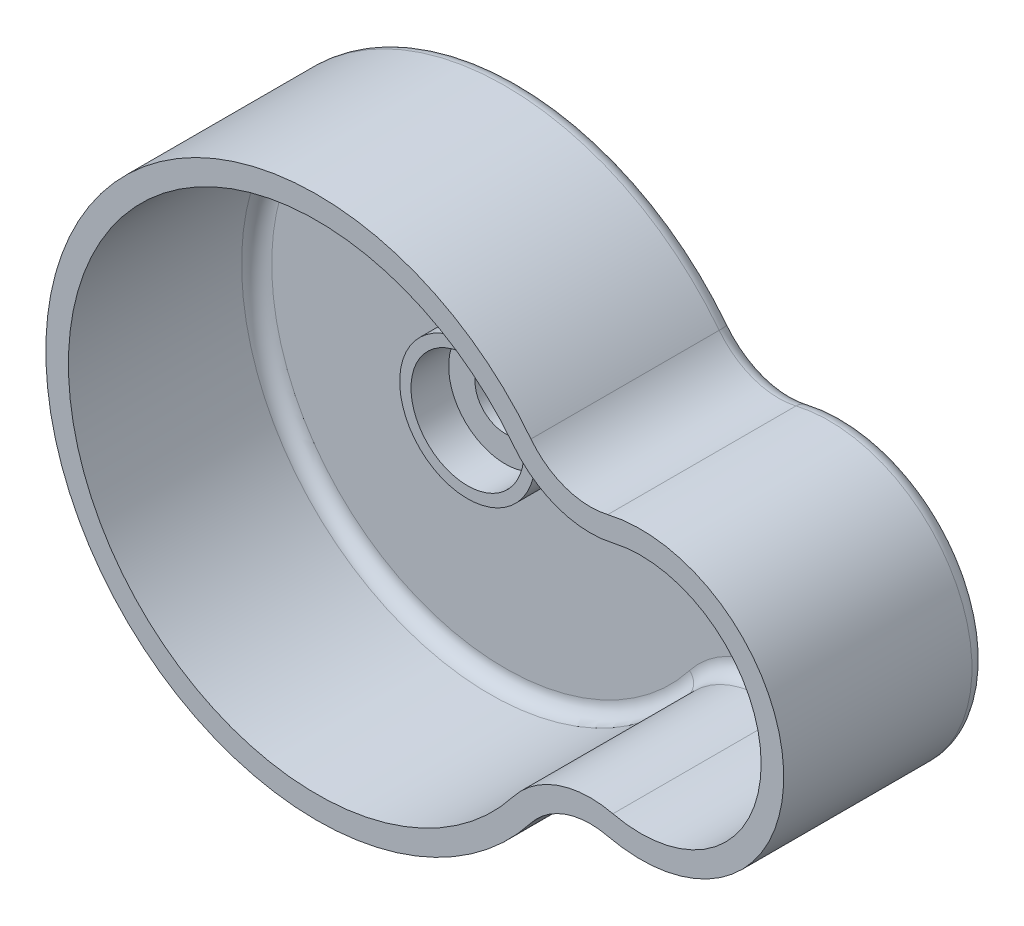
ISO-10303-21;
HEADER;
FILE_DESCRIPTION(('STEP AP214'),'2;1');
FILE_NAME('part.step','',(''),(''),'','','');
FILE_SCHEMA(('AUTOMOTIVE_DESIGN { 1 0 10303 214 1 1 1 1 }'));
ENDSEC;
DATA;
#1=APPLICATION_CONTEXT('core data for automotive mechanical design processes');
#2=APPLICATION_PROTOCOL_DEFINITION('international standard','automotive_design',2000,#1);
#3=PRODUCT_CONTEXT('',#1,'mechanical');
#4=PRODUCT('Part','Part','',(#3));
#5=PRODUCT_RELATED_PRODUCT_CATEGORY('part','',(#4));
#6=PRODUCT_DEFINITION_FORMATION('','',#4);
#7=PRODUCT_DEFINITION_CONTEXT('part definition',#1,'design');
#8=PRODUCT_DEFINITION('design','',#6,#7);
#9=PRODUCT_DEFINITION_SHAPE('','',#8);
#10=(LENGTH_UNIT() NAMED_UNIT(*) SI_UNIT(.MILLI.,.METRE.));
#11=(NAMED_UNIT(*) PLANE_ANGLE_UNIT() SI_UNIT($,.RADIAN.));
#12=(NAMED_UNIT(*) SI_UNIT($,.STERADIAN.) SOLID_ANGLE_UNIT());
#13=UNCERTAINTY_MEASURE_WITH_UNIT(LENGTH_MEASURE(1.E-05),#10,'distance_accuracy_value','');
#14=(GEOMETRIC_REPRESENTATION_CONTEXT(3) GLOBAL_UNCERTAINTY_ASSIGNED_CONTEXT((#13)) GLOBAL_UNIT_ASSIGNED_CONTEXT((#10,
#11,#12)) REPRESENTATION_CONTEXT('',''));
#15=CARTESIAN_POINT('',(0.,0.,0.));
#16=DIRECTION('',(0.,0.,1.));
#17=DIRECTION('',(1.,0.,0.));
#18=AXIS2_PLACEMENT_3D('',#15,#16,#17);
#19=CARTESIAN_POINT('',(0.,0.,2.));
#20=DIRECTION('',(0.,0.,1.));
#21=DIRECTION('',(1.,0.,0.));
#22=AXIS2_PLACEMENT_3D('',#19,#20,#21);
#23=PLANE('',#22);
#24=CARTESIAN_POINT('',(43.,0.,2.));
#25=DIRECTION('',(0.,0.,1.));
#26=DIRECTION('',(1.,0.,0.));
#27=AXIS2_PLACEMENT_3D('',#24,#25,#26);
#28=CIRCLE('',#27,4.);
#29=CARTESIAN_POINT('',(47.,0.,2.));
#30=VERTEX_POINT('',#29);
#31=EDGE_CURVE('E215',#30,#30,#28,.T.);
#32=ORIENTED_EDGE('',*,*,#31,.F.);
#33=EDGE_LOOP('',(#32));
#34=FACE_BOUND('',#33,.T.);
#35=CARTESIAN_POINT('',(43.,0.,2.));
#36=DIRECTION('',(0.,0.,1.));
#37=DIRECTION('',(1.,0.,0.));
#38=AXIS2_PLACEMENT_3D('',#35,#36,#37);
#39=CIRCLE('',#38,7.5);
#40=CARTESIAN_POINT('',(50.5,0.,2.));
#41=VERTEX_POINT('',#40);
#42=EDGE_CURVE('E197',#41,#41,#39,.F.);
#43=ORIENTED_EDGE('',*,*,#42,.F.);
#44=EDGE_LOOP('',(#43));
#45=FACE_BOUND('',#44,.T.);
#46=ADVANCED_FACE('F41',(#34,#45),#23,.T.);
#47=CARTESIAN_POINT('',(0.,0.,2.));
#48=DIRECTION('',(0.,0.,1.));
#49=DIRECTION('',(1.,0.,0.));
#50=AXIS2_PLACEMENT_3D('',#47,#48,#49);
#51=CIRCLE('',#50,4.);
#52=CARTESIAN_POINT('',(4.,0.,2.));
#53=VERTEX_POINT('',#52);
#54=EDGE_CURVE('E212',#53,#53,#51,.T.);
#55=ORIENTED_EDGE('',*,*,#54,.F.);
#56=EDGE_LOOP('',(#55));
#57=FACE_BOUND('',#56,.T.);
#58=CARTESIAN_POINT('',(0.,0.,2.));
#59=DIRECTION('',(0.,0.,1.));
#60=DIRECTION('',(1.,0.,0.));
#61=AXIS2_PLACEMENT_3D('',#58,#59,#60);
#62=CIRCLE('',#61,7.5);
#63=CARTESIAN_POINT('',(7.5,0.,2.));
#64=VERTEX_POINT('',#63);
#65=EDGE_CURVE('E142',#64,#64,#62,.F.);
#66=ORIENTED_EDGE('',*,*,#65,.F.);
#67=EDGE_LOOP('',(#66));
#68=FACE_BOUND('',#67,.T.);
#69=ADVANCED_FACE('F311',(#57,#68),#23,.T.);
#70=CARTESIAN_POINT('',(36.3255813953488,28.2214835947703,2.));
#71=DIRECTION('',(0.,0.,-1.));
#72=DIRECTION('',(-1.,0.,0.));
#73=AXIS2_PLACEMENT_3D('',#70,#71,#72);
#74=CYLINDRICAL_SURFACE('',#73,10.);
#75=DIRECTION('',(0.,0.,-1.));
#76=VECTOR('',#75,1.);
#77=CARTESIAN_POINT('',(38.6271050521251,18.4899375276081,2.));
#78=LINE('',#77,#76);
#79=CARTESIAN_POINT('',(38.6271050521251,18.4899375276081,27.));
#80=VERTEX_POINT('',#79);
#81=CARTESIAN_POINT('',(38.6271050521251,18.4899375276081,2.));
#82=VERTEX_POINT('',#81);
#83=EDGE_CURVE('E219',#80,#82,#78,.T.);
#84=ORIENTED_EDGE('',*,*,#83,.T.);
#85=CARTESIAN_POINT('',(36.3255813953488,28.2214835947703,2.));
#86=DIRECTION('',(0.,0.,1.));
#87=DIRECTION('',(1.,0.,0.));
#88=AXIS2_PLACEMENT_3D('',#85,#86,#87);
#89=CIRCLE('',#88,10.);
#90=CARTESIAN_POINT('',(28.4287158746208,22.0863784654724,2.));
#91=VERTEX_POINT('',#90);
#92=EDGE_CURVE('E139',#82,#91,#89,.F.);
#93=ORIENTED_EDGE('',*,*,#92,.T.);
#94=DIRECTION('',(0.,0.,-1.));
#95=VECTOR('',#94,1.);
#96=CARTESIAN_POINT('',(28.4287158746208,22.0863784654724,2.));
#97=LINE('',#96,#95);
#98=CARTESIAN_POINT('',(28.4287158746208,22.0863784654724,27.));
#99=VERTEX_POINT('',#98);
#100=EDGE_CURVE('E132',#99,#91,#97,.T.);
#101=ORIENTED_EDGE('',*,*,#100,.F.);
#102=CARTESIAN_POINT('',(36.3255813953488,28.2214835947703,27.));
#103=DIRECTION('',(0.,0.,1.));
#104=DIRECTION('',(1.,0.,0.));
#105=AXIS2_PLACEMENT_3D('',#102,#103,#104);
#106=CIRCLE('',#105,10.);
#107=EDGE_CURVE('E137',#99,#80,#106,.T.);
#108=ORIENTED_EDGE('',*,*,#107,.T.);
#109=EDGE_LOOP('',(#84,#93,#101,#108));
#110=FACE_BOUND('',#109,.T.);
#111=ADVANCED_FACE('F135',(#110),#74,.F.);
#112=CARTESIAN_POINT('',(0.,0.,2.));
#113=DIRECTION('',(0.,0.,-1.));
#114=DIRECTION('',(-1.,0.,0.));
#115=AXIS2_PLACEMENT_3D('',#112,#113,#114);
#116=CYLINDRICAL_SURFACE('',#115,36.);
#117=ORIENTED_EDGE('',*,*,#100,.T.);
#118=CARTESIAN_POINT('',(0.,0.,2.));
#119=DIRECTION('',(0.,0.,1.));
#120=DIRECTION('',(1.,0.,0.));
#121=AXIS2_PLACEMENT_3D('',#118,#119,#120);
#122=CIRCLE('',#121,36.);
#123=CARTESIAN_POINT('',(28.4287158746208,-22.0863784654724,2.));
#124=VERTEX_POINT('',#123);
#125=EDGE_CURVE('E240',#91,#124,#122,.T.);
#126=ORIENTED_EDGE('',*,*,#125,.T.);
#127=DIRECTION('',(0.,0.,-1.));
#128=VECTOR('',#127,1.);
#129=CARTESIAN_POINT('',(28.4287158746208,-22.0863784654724,2.));
#130=LINE('',#129,#128);
#131=CARTESIAN_POINT('',(28.4287158746208,-22.0863784654724,27.));
#132=VERTEX_POINT('',#131);
#133=EDGE_CURVE('E143',#132,#124,#130,.T.);
#134=ORIENTED_EDGE('',*,*,#133,.F.);
#135=CARTESIAN_POINT('',(0.,0.,27.));
#136=DIRECTION('',(0.,0.,1.));
#137=DIRECTION('',(1.,0.,0.));
#138=AXIS2_PLACEMENT_3D('',#135,#136,#137);
#139=CIRCLE('',#138,36.);
#140=EDGE_CURVE('E146',#99,#132,#139,.T.);
#141=ORIENTED_EDGE('',*,*,#140,.F.);
#142=EDGE_LOOP('',(#117,#126,#134,#141));
#143=FACE_BOUND('',#142,.T.);
#144=ADVANCED_FACE('F147',(#143),#116,.T.);
#145=CARTESIAN_POINT('',(36.3255813953488,-28.2214835947703,2.));
#146=DIRECTION('',(0.,0.,-1.));
#147=DIRECTION('',(-1.,0.,0.));
#148=AXIS2_PLACEMENT_3D('',#145,#146,#147);
#149=CYLINDRICAL_SURFACE('',#148,10.);
#150=ORIENTED_EDGE('',*,*,#133,.T.);
#151=CARTESIAN_POINT('',(36.3255813953488,-28.2214835947703,2.));
#152=DIRECTION('',(0.,0.,1.));
#153=DIRECTION('',(1.,0.,0.));
#154=AXIS2_PLACEMENT_3D('',#151,#152,#153);
#155=CIRCLE('',#154,10.);
#156=CARTESIAN_POINT('',(38.6271050521251,-18.4899375276081,2.));
#157=VERTEX_POINT('',#156);
#158=EDGE_CURVE('E200',#124,#157,#155,.F.);
#159=ORIENTED_EDGE('',*,*,#158,.T.);
#160=DIRECTION('',(0.,0.,-1.));
#161=VECTOR('',#160,1.);
#162=CARTESIAN_POINT('',(38.6271050521251,-18.4899375276081,2.));
#163=LINE('',#162,#161);
#164=CARTESIAN_POINT('',(38.6271050521251,-18.4899375276081,27.));
#165=VERTEX_POINT('',#164);
#166=EDGE_CURVE('E225',#165,#157,#163,.T.);
#167=ORIENTED_EDGE('',*,*,#166,.F.);
#168=CARTESIAN_POINT('',(36.3255813953488,-28.2214835947703,27.));
#169=DIRECTION('',(0.,0.,1.));
#170=DIRECTION('',(1.,0.,0.));
#171=AXIS2_PLACEMENT_3D('',#168,#169,#170);
#172=CIRCLE('',#171,10.);
#173=EDGE_CURVE('E152',#132,#165,#172,.F.);
#174=ORIENTED_EDGE('',*,*,#173,.F.);
#175=EDGE_LOOP('',(#150,#159,#167,#174));
#176=FACE_BOUND('',#175,.T.);
#177=ADVANCED_FACE('F343',(#176),#149,.F.);
#178=CARTESIAN_POINT('',(0.,0.,2.));
#179=DIRECTION('',(0.,0.,-1.));
#180=DIRECTION('',(-1.,0.,0.));
#181=AXIS2_PLACEMENT_3D('',#178,#179,#180);
#182=CYLINDRICAL_SURFACE('',#181,4.);
#183=ORIENTED_EDGE('',*,*,#54,.T.);
#184=EDGE_LOOP('',(#183));
#185=FACE_BOUND('',#184,.T.);
#186=CARTESIAN_POINT('',(0.,0.,0.));
#187=DIRECTION('',(0.,0.,1.));
#188=DIRECTION('',(1.,0.,0.));
#189=AXIS2_PLACEMENT_3D('',#186,#187,#188);
#190=CIRCLE('',#189,4.);
#191=CARTESIAN_POINT('',(4.,0.,0.));
#192=VERTEX_POINT('',#191);
#193=EDGE_CURVE('E209',#192,#192,#190,.T.);
#194=ORIENTED_EDGE('',*,*,#193,.F.);
#195=EDGE_LOOP('',(#194));
#196=FACE_BOUND('',#195,.T.);
#197=ADVANCED_FACE('F337',(#185,#196),#182,.F.);
#198=CARTESIAN_POINT('',(43.,0.,2.));
#199=DIRECTION('',(0.,0.,-1.));
#200=DIRECTION('',(-1.,0.,0.));
#201=AXIS2_PLACEMENT_3D('',#198,#199,#200);
#202=CYLINDRICAL_SURFACE('',#201,19.);
#203=ORIENTED_EDGE('',*,*,#166,.T.);
#204=CARTESIAN_POINT('',(43.,0.,2.));
#205=DIRECTION('',(0.,0.,1.));
#206=DIRECTION('',(1.,0.,0.));
#207=AXIS2_PLACEMENT_3D('',#204,#205,#206);
#208=CIRCLE('',#207,19.);
#209=EDGE_CURVE('E50',#157,#82,#208,.T.);
#210=ORIENTED_EDGE('',*,*,#209,.T.);
#211=ORIENTED_EDGE('',*,*,#83,.F.);
#212=CARTESIAN_POINT('',(43.,0.,27.));
#213=DIRECTION('',(0.,0.,1.));
#214=DIRECTION('',(1.,0.,0.));
#215=AXIS2_PLACEMENT_3D('',#212,#213,#214);
#216=CIRCLE('',#215,19.);
#217=EDGE_CURVE('E158',#165,#80,#216,.T.);
#218=ORIENTED_EDGE('',*,*,#217,.F.);
#219=EDGE_LOOP('',(#203,#210,#211,#218));
#220=FACE_BOUND('',#219,.T.);
#221=ADVANCED_FACE('F331',(#220),#202,.T.);
#222=CARTESIAN_POINT('',(43.,0.,2.));
#223=DIRECTION('',(0.,0.,-1.));
#224=DIRECTION('',(-1.,0.,0.));
#225=AXIS2_PLACEMENT_3D('',#222,#223,#224);
#226=CYLINDRICAL_SURFACE('',#225,4.);
#227=ORIENTED_EDGE('',*,*,#31,.T.);
#228=EDGE_LOOP('',(#227));
#229=FACE_BOUND('',#228,.T.);
#230=CARTESIAN_POINT('',(43.,0.,0.));
#231=DIRECTION('',(0.,0.,1.));
#232=DIRECTION('',(1.,0.,0.));
#233=AXIS2_PLACEMENT_3D('',#230,#231,#232);
#234=CIRCLE('',#233,4.);
#235=CARTESIAN_POINT('',(47.,0.,0.));
#236=VERTEX_POINT('',#235);
#237=EDGE_CURVE('E216',#236,#236,#234,.T.);
#238=ORIENTED_EDGE('',*,*,#237,.F.);
#239=EDGE_LOOP('',(#238));
#240=FACE_BOUND('',#239,.T.);
#241=ADVANCED_FACE('F324',(#229,#240),#226,.F.);
#242=CARTESIAN_POINT('',(0.,0.,2.));
#243=DIRECTION('',(0.,0.,1.));
#244=DIRECTION('',(1.,0.,0.));
#245=AXIS2_PLACEMENT_3D('',#242,#243,#244);
#246=CIRCLE('',#245,31.);
#247=CARTESIAN_POINT('',(24.4802831142568,19.0188259008234,2.));
#248=VERTEX_POINT('',#247);
#249=CARTESIAN_POINT('',(24.4802831142568,-19.0188259008234,2.));
#250=VERTEX_POINT('',#249);
#251=EDGE_CURVE('E246',#248,#250,#246,.T.);
#252=ORIENTED_EDGE('',*,*,#251,.T.);
#253=CARTESIAN_POINT('',(36.3255813953488,-28.2214835947703,2.));
#254=DIRECTION('',(0.,0.,1.));
#255=DIRECTION('',(1.,0.,0.));
#256=AXIS2_PLACEMENT_3D('',#253,#254,#255);
#257=CIRCLE('',#256,15.);
#258=CARTESIAN_POINT('',(39.7778668805132,-13.624164494027,2.));
#259=VERTEX_POINT('',#258);
#260=EDGE_CURVE('E252',#250,#259,#257,.F.);
#261=ORIENTED_EDGE('',*,*,#260,.T.);
#262=CARTESIAN_POINT('',(43.,0.,2.));
#263=DIRECTION('',(0.,0.,1.));
#264=DIRECTION('',(1.,0.,0.));
#265=AXIS2_PLACEMENT_3D('',#262,#263,#264);
#266=CIRCLE('',#265,14.);
#267=CARTESIAN_POINT('',(39.7778668805132,13.624164494027,2.));
#268=VERTEX_POINT('',#267);
#269=EDGE_CURVE('E250',#259,#268,#266,.T.);
#270=ORIENTED_EDGE('',*,*,#269,.T.);
#271=CARTESIAN_POINT('',(36.3255813953488,28.2214835947703,2.));
#272=DIRECTION('',(0.,0.,1.));
#273=DIRECTION('',(1.,0.,0.));
#274=AXIS2_PLACEMENT_3D('',#271,#272,#273);
#275=CIRCLE('',#274,15.);
#276=EDGE_CURVE('E248',#268,#248,#275,.F.);
#277=ORIENTED_EDGE('',*,*,#276,.T.);
#278=EDGE_LOOP('',(#252,#261,#270,#277));
#279=FACE_BOUND('',#278,.T.);
#280=CARTESIAN_POINT('',(43.,0.,2.));
#281=DIRECTION('',(0.,0.,1.));
#282=DIRECTION('',(1.,0.,0.));
#283=AXIS2_PLACEMENT_3D('',#280,#281,#282);
#284=CIRCLE('',#283,9.);
#285=CARTESIAN_POINT('',(52.,0.,2.));
#286=VERTEX_POINT('',#285);
#287=EDGE_CURVE('E193',#286,#286,#284,.F.);
#288=ORIENTED_EDGE('',*,*,#287,.T.);
#289=EDGE_LOOP('',(#288));
#290=FACE_BOUND('',#289,.T.);
#291=CARTESIAN_POINT('',(0.,0.,2.));
#292=DIRECTION('',(0.,0.,1.));
#293=DIRECTION('',(1.,0.,0.));
#294=AXIS2_PLACEMENT_3D('',#291,#292,#293);
#295=CIRCLE('',#294,9.);
#296=CARTESIAN_POINT('',(9.,0.,2.));
#297=VERTEX_POINT('',#296);
#298=EDGE_CURVE('E206',#297,#297,#295,.F.);
#299=ORIENTED_EDGE('',*,*,#298,.T.);
#300=EDGE_LOOP('',(#299));
#301=FACE_BOUND('',#300,.T.);
#302=ADVANCED_FACE('F283',(#279,#290,#301),#23,.T.);
#303=CARTESIAN_POINT('',(0.,0.,0.));
#304=DIRECTION('',(0.,0.,1.));
#305=DIRECTION('',(1.,0.,0.));
#306=AXIS2_PLACEMENT_3D('',#303,#304,#305);
#307=PLANE('',#306);
#308=CARTESIAN_POINT('',(43.,0.,0.));
#309=DIRECTION('',(0.,0.,1.));
#310=DIRECTION('',(1.,0.,0.));
#311=AXIS2_PLACEMENT_3D('',#308,#309,#310);
#312=CIRCLE('',#311,17.);
#313=CARTESIAN_POINT('',(39.0874097834804,16.5436283141757,0.));
#314=VERTEX_POINT('',#313);
#315=CARTESIAN_POINT('',(39.0874097834803,-16.5436283141757,0.));
#316=VERTEX_POINT('',#315);
#317=EDGE_CURVE('E231',#314,#316,#312,.F.);
#318=ORIENTED_EDGE('',*,*,#317,.T.);
#319=CARTESIAN_POINT('',(36.3255813953488,-28.2214835947703,0.));
#320=DIRECTION('',(0.,0.,1.));
#321=DIRECTION('',(1.,0.,0.));
#322=AXIS2_PLACEMENT_3D('',#319,#320,#321);
#323=CIRCLE('',#322,12.);
#324=CARTESIAN_POINT('',(26.8493427704752,-20.8593574396128,0.));
#325=VERTEX_POINT('',#324);
#326=EDGE_CURVE('E237',#316,#325,#323,.T.);
#327=ORIENTED_EDGE('',*,*,#326,.T.);
#328=CARTESIAN_POINT('',(0.,0.,0.));
#329=DIRECTION('',(0.,0.,1.));
#330=DIRECTION('',(1.,0.,0.));
#331=AXIS2_PLACEMENT_3D('',#328,#329,#330);
#332=CIRCLE('',#331,34.);
#333=CARTESIAN_POINT('',(26.8493427704752,20.8593574396128,0.));
#334=VERTEX_POINT('',#333);
#335=EDGE_CURVE('E235',#325,#334,#332,.F.);
#336=ORIENTED_EDGE('',*,*,#335,.T.);
#337=CARTESIAN_POINT('',(36.3255813953488,28.2214835947703,0.));
#338=DIRECTION('',(0.,0.,1.));
#339=DIRECTION('',(1.,0.,0.));
#340=AXIS2_PLACEMENT_3D('',#337,#338,#339);
#341=CIRCLE('',#340,12.);
#342=EDGE_CURVE('E233',#334,#314,#341,.T.);
#343=ORIENTED_EDGE('',*,*,#342,.T.);
#344=EDGE_LOOP('',(#318,#327,#336,#343));
#345=FACE_BOUND('',#344,.T.);
#346=ORIENTED_EDGE('',*,*,#193,.T.);
#347=EDGE_LOOP('',(#346));
#348=FACE_BOUND('',#347,.T.);
#349=ORIENTED_EDGE('',*,*,#237,.T.);
#350=EDGE_LOOP('',(#349));
#351=FACE_BOUND('',#350,.T.);
#352=ADVANCED_FACE('F323',(#345,#348,#351),#307,.F.);
#353=CARTESIAN_POINT('',(0.,0.,7.));
#354=DIRECTION('',(0.,0.,-1.));
#355=DIRECTION('',(-1.,0.,0.));
#356=AXIS2_PLACEMENT_3D('',#353,#354,#355);
#357=CYLINDRICAL_SURFACE('',#356,7.5);
#358=ORIENTED_EDGE('',*,*,#65,.T.);
#359=EDGE_LOOP('',(#358));
#360=FACE_BOUND('',#359,.T.);
#361=CARTESIAN_POINT('',(0.,0.,7.));
#362=DIRECTION('',(0.,0.,1.));
#363=DIRECTION('',(1.,0.,0.));
#364=AXIS2_PLACEMENT_3D('',#361,#362,#363);
#365=CIRCLE('',#364,7.5);
#366=CARTESIAN_POINT('',(7.5,0.,7.));
#367=VERTEX_POINT('',#366);
#368=EDGE_CURVE('E196',#367,#367,#365,.T.);
#369=ORIENTED_EDGE('',*,*,#368,.T.);
#370=EDGE_LOOP('',(#369));
#371=FACE_BOUND('',#370,.T.);
#372=ADVANCED_FACE('F329',(#360,#371),#357,.F.);
#373=CARTESIAN_POINT('',(0.,0.,7.));
#374=DIRECTION('',(0.,0.,-1.));
#375=DIRECTION('',(-1.,0.,0.));
#376=AXIS2_PLACEMENT_3D('',#373,#374,#375);
#377=CYLINDRICAL_SURFACE('',#376,9.);
#378=ORIENTED_EDGE('',*,*,#298,.F.);
#379=EDGE_LOOP('',(#378));
#380=FACE_BOUND('',#379,.T.);
#381=CARTESIAN_POINT('',(0.,0.,7.));
#382=DIRECTION('',(0.,0.,1.));
#383=DIRECTION('',(1.,0.,0.));
#384=AXIS2_PLACEMENT_3D('',#381,#382,#383);
#385=CIRCLE('',#384,9.);
#386=CARTESIAN_POINT('',(9.,0.,7.));
#387=VERTEX_POINT('',#386);
#388=EDGE_CURVE('E203',#387,#387,#385,.T.);
#389=ORIENTED_EDGE('',*,*,#388,.F.);
#390=EDGE_LOOP('',(#389));
#391=FACE_BOUND('',#390,.T.);
#392=ADVANCED_FACE('F487',(#380,#391),#377,.T.);
#393=CARTESIAN_POINT('',(0.,0.,7.));
#394=DIRECTION('',(0.,0.,1.));
#395=DIRECTION('',(1.,0.,0.));
#396=AXIS2_PLACEMENT_3D('',#393,#394,#395);
#397=PLANE('',#396);
#398=ORIENTED_EDGE('',*,*,#368,.F.);
#399=EDGE_LOOP('',(#398));
#400=FACE_BOUND('',#399,.T.);
#401=ORIENTED_EDGE('',*,*,#388,.T.);
#402=EDGE_LOOP('',(#401));
#403=FACE_BOUND('',#402,.T.);
#404=ADVANCED_FACE('F497',(#400,#403),#397,.T.);
#405=CARTESIAN_POINT('',(43.,0.,7.));
#406=DIRECTION('',(0.,0.,-1.));
#407=DIRECTION('',(-1.,0.,0.));
#408=AXIS2_PLACEMENT_3D('',#405,#406,#407);
#409=CYLINDRICAL_SURFACE('',#408,7.5);
#410=ORIENTED_EDGE('',*,*,#42,.T.);
#411=EDGE_LOOP('',(#410));
#412=FACE_BOUND('',#411,.T.);
#413=CARTESIAN_POINT('',(43.,0.,7.));
#414=DIRECTION('',(0.,0.,1.));
#415=DIRECTION('',(1.,0.,0.));
#416=AXIS2_PLACEMENT_3D('',#413,#414,#415);
#417=CIRCLE('',#416,7.5);
#418=CARTESIAN_POINT('',(50.5,0.,7.));
#419=VERTEX_POINT('',#418);
#420=EDGE_CURVE('E187',#419,#419,#417,.T.);
#421=ORIENTED_EDGE('',*,*,#420,.T.);
#422=EDGE_LOOP('',(#421));
#423=FACE_BOUND('',#422,.T.);
#424=ADVANCED_FACE('F508',(#412,#423),#409,.F.);
#425=CARTESIAN_POINT('',(43.,0.,7.));
#426=DIRECTION('',(0.,0.,-1.));
#427=DIRECTION('',(-1.,0.,0.));
#428=AXIS2_PLACEMENT_3D('',#425,#426,#427);
#429=CYLINDRICAL_SURFACE('',#428,9.);
#430=ORIENTED_EDGE('',*,*,#287,.F.);
#431=EDGE_LOOP('',(#430));
#432=FACE_BOUND('',#431,.T.);
#433=CARTESIAN_POINT('',(43.,0.,7.));
#434=DIRECTION('',(0.,0.,1.));
#435=DIRECTION('',(1.,0.,0.));
#436=AXIS2_PLACEMENT_3D('',#433,#434,#435);
#437=CIRCLE('',#436,9.);
#438=CARTESIAN_POINT('',(52.,0.,7.));
#439=VERTEX_POINT('',#438);
#440=EDGE_CURVE('E190',#439,#439,#437,.T.);
#441=ORIENTED_EDGE('',*,*,#440,.F.);
#442=EDGE_LOOP('',(#441));
#443=FACE_BOUND('',#442,.T.);
#444=ADVANCED_FACE('F519',(#432,#443),#429,.T.);
#445=CARTESIAN_POINT('',(0.,0.,7.));
#446=DIRECTION('',(0.,0.,1.));
#447=DIRECTION('',(1.,0.,0.));
#448=AXIS2_PLACEMENT_3D('',#445,#446,#447);
#449=PLANE('',#448);
#450=ORIENTED_EDGE('',*,*,#420,.F.);
#451=EDGE_LOOP('',(#450));
#452=FACE_BOUND('',#451,.T.);
#453=ORIENTED_EDGE('',*,*,#440,.T.);
#454=EDGE_LOOP('',(#453));
#455=FACE_BOUND('',#454,.T.);
#456=ADVANCED_FACE('F308',(#452,#455),#449,.T.);
#457=CARTESIAN_POINT('',(0.,0.,27.));
#458=DIRECTION('',(0.,0.,-1.));
#459=DIRECTION('',(-1.,0.,0.));
#460=AXIS2_PLACEMENT_3D('',#457,#458,#459);
#461=CYLINDRICAL_SURFACE('',#460,33.);
#462=DIRECTION('',(0.,0.,-1.));
#463=VECTOR('',#462,1.);
#464=CARTESIAN_POINT('',(26.0596562184024,-20.245846926683,27.));
#465=LINE('',#464,#463);
#466=CARTESIAN_POINT('',(26.0596562184024,-20.245846926683,27.));
#467=VERTEX_POINT('',#466);
#468=CARTESIAN_POINT('',(26.0596562184024,-20.245846926683,4.));
#469=VERTEX_POINT('',#468);
#470=EDGE_CURVE('E178',#467,#469,#465,.T.);
#471=ORIENTED_EDGE('',*,*,#470,.T.);
#472=CARTESIAN_POINT('',(0.,0.,4.));
#473=DIRECTION('',(0.,0.,1.));
#474=DIRECTION('',(1.,0.,0.));
#475=AXIS2_PLACEMENT_3D('',#472,#473,#474);
#476=CIRCLE('',#475,33.);
#477=CARTESIAN_POINT('',(26.0596562184024,20.245846926683,4.));
#478=VERTEX_POINT('',#477);
#479=EDGE_CURVE('E11',#469,#478,#476,.F.);
#480=ORIENTED_EDGE('',*,*,#479,.T.);
#481=DIRECTION('',(0.,0.,-1.));
#482=VECTOR('',#481,1.);
#483=CARTESIAN_POINT('',(26.0596562184024,20.245846926683,27.));
#484=LINE('',#483,#482);
#485=CARTESIAN_POINT('',(26.0596562184024,20.245846926683,27.));
#486=VERTEX_POINT('',#485);
#487=EDGE_CURVE('E185',#486,#478,#484,.T.);
#488=ORIENTED_EDGE('',*,*,#487,.F.);
#489=CARTESIAN_POINT('',(0.,0.,27.));
#490=DIRECTION('',(0.,0.,1.));
#491=DIRECTION('',(1.,0.,0.));
#492=AXIS2_PLACEMENT_3D('',#489,#490,#491);
#493=CIRCLE('',#492,33.);
#494=EDGE_CURVE('E167',#486,#467,#493,.T.);
#495=ORIENTED_EDGE('',*,*,#494,.T.);
#496=EDGE_LOOP('',(#471,#480,#488,#495));
#497=FACE_BOUND('',#496,.T.);
#498=ADVANCED_FACE('F293',(#497),#461,.F.);
#499=CARTESIAN_POINT('',(36.3255813953488,28.2214835947703,27.));
#500=DIRECTION('',(0.,0.,-1.));
#501=DIRECTION('',(-1.,0.,0.));
#502=AXIS2_PLACEMENT_3D('',#499,#500,#501);
#503=CYLINDRICAL_SURFACE('',#502,13.);
#504=ORIENTED_EDGE('',*,*,#487,.T.);
#505=CARTESIAN_POINT('',(36.3255813953488,28.2214835947703,4.));
#506=DIRECTION('',(0.,0.,1.));
#507=DIRECTION('',(1.,0.,0.));
#508=AXIS2_PLACEMENT_3D('',#505,#506,#507);
#509=CIRCLE('',#508,13.);
#510=CARTESIAN_POINT('',(39.317562149158,15.5704737074594,4.));
#511=VERTEX_POINT('',#510);
#512=EDGE_CURVE('E63',#478,#511,#509,.T.);
#513=ORIENTED_EDGE('',*,*,#512,.T.);
#514=DIRECTION('',(0.,0.,-1.));
#515=VECTOR('',#514,1.);
#516=CARTESIAN_POINT('',(39.317562149158,15.5704737074594,27.));
#517=LINE('',#516,#515);
#518=CARTESIAN_POINT('',(39.317562149158,15.5704737074594,27.));
#519=VERTEX_POINT('',#518);
#520=EDGE_CURVE('E183',#519,#511,#517,.T.);
#521=ORIENTED_EDGE('',*,*,#520,.F.);
#522=CARTESIAN_POINT('',(36.3255813953488,28.2214835947703,27.));
#523=DIRECTION('',(0.,0.,1.));
#524=DIRECTION('',(1.,0.,0.));
#525=AXIS2_PLACEMENT_3D('',#522,#523,#524);
#526=CIRCLE('',#525,13.);
#527=EDGE_CURVE('E170',#486,#519,#526,.T.);
#528=ORIENTED_EDGE('',*,*,#527,.F.);
#529=EDGE_LOOP('',(#504,#513,#521,#528));
#530=FACE_BOUND('',#529,.T.);
#531=ADVANCED_FACE('F300',(#530),#503,.T.);
#532=CARTESIAN_POINT('',(43.,0.,27.));
#533=DIRECTION('',(0.,0.,-1.));
#534=DIRECTION('',(-1.,0.,0.));
#535=AXIS2_PLACEMENT_3D('',#532,#533,#534);
#536=CYLINDRICAL_SURFACE('',#535,16.);
#537=ORIENTED_EDGE('',*,*,#520,.T.);
#538=CARTESIAN_POINT('',(43.,0.,4.));
#539=DIRECTION('',(0.,0.,1.));
#540=DIRECTION('',(1.,0.,0.));
#541=AXIS2_PLACEMENT_3D('',#538,#539,#540);
#542=CIRCLE('',#541,16.);
#543=CARTESIAN_POINT('',(39.317562149158,-15.5704737074595,4.));
#544=VERTEX_POINT('',#543);
#545=EDGE_CURVE('E255',#511,#544,#542,.F.);
#546=ORIENTED_EDGE('',*,*,#545,.T.);
#547=DIRECTION('',(0.,0.,-1.));
#548=VECTOR('',#547,1.);
#549=CARTESIAN_POINT('',(39.317562149158,-15.5704737074595,27.));
#550=LINE('',#549,#548);
#551=CARTESIAN_POINT('',(39.317562149158,-15.5704737074595,27.));
#552=VERTEX_POINT('',#551);
#553=EDGE_CURVE('E180',#552,#544,#550,.T.);
#554=ORIENTED_EDGE('',*,*,#553,.F.);
#555=CARTESIAN_POINT('',(43.,0.,27.));
#556=DIRECTION('',(0.,0.,1.));
#557=DIRECTION('',(1.,0.,0.));
#558=AXIS2_PLACEMENT_3D('',#555,#556,#557);
#559=CIRCLE('',#558,16.);
#560=EDGE_CURVE('E172',#552,#519,#559,.T.);
#561=ORIENTED_EDGE('',*,*,#560,.T.);
#562=EDGE_LOOP('',(#537,#546,#554,#561));
#563=FACE_BOUND('',#562,.T.);
#564=ADVANCED_FACE('F299',(#563),#536,.F.);
#565=CARTESIAN_POINT('',(36.3255813953488,-28.2214835947703,27.));
#566=DIRECTION('',(0.,0.,-1.));
#567=DIRECTION('',(-1.,0.,0.));
#568=AXIS2_PLACEMENT_3D('',#565,#566,#567);
#569=CYLINDRICAL_SURFACE('',#568,13.);
#570=ORIENTED_EDGE('',*,*,#553,.T.);
#571=CARTESIAN_POINT('',(36.3255813953488,-28.2214835947703,4.));
#572=DIRECTION('',(0.,0.,1.));
#573=DIRECTION('',(1.,0.,0.));
#574=AXIS2_PLACEMENT_3D('',#571,#572,#573);
#575=CIRCLE('',#574,13.);
#576=EDGE_CURVE('E243',#544,#469,#575,.T.);
#577=ORIENTED_EDGE('',*,*,#576,.T.);
#578=ORIENTED_EDGE('',*,*,#470,.F.);
#579=CARTESIAN_POINT('',(36.3255813953488,-28.2214835947703,27.));
#580=DIRECTION('',(0.,0.,1.));
#581=DIRECTION('',(1.,0.,0.));
#582=AXIS2_PLACEMENT_3D('',#579,#580,#581);
#583=CIRCLE('',#582,13.);
#584=EDGE_CURVE('E175',#467,#552,#583,.F.);
#585=ORIENTED_EDGE('',*,*,#584,.T.);
#586=EDGE_LOOP('',(#570,#577,#578,#585));
#587=FACE_BOUND('',#586,.T.);
#588=ADVANCED_FACE('F292',(#587),#569,.T.);
#589=CARTESIAN_POINT('',(0.,0.,27.));
#590=DIRECTION('',(0.,0.,1.));
#591=DIRECTION('',(1.,0.,0.));
#592=AXIS2_PLACEMENT_3D('',#589,#590,#591);
#593=PLANE('',#592);
#594=ORIENTED_EDGE('',*,*,#107,.F.);
#595=ORIENTED_EDGE('',*,*,#140,.T.);
#596=ORIENTED_EDGE('',*,*,#173,.T.);
#597=ORIENTED_EDGE('',*,*,#217,.T.);
#598=EDGE_LOOP('',(#594,#595,#596,#597));
#599=FACE_BOUND('',#598,.T.);
#600=ORIENTED_EDGE('',*,*,#494,.F.);
#601=ORIENTED_EDGE('',*,*,#527,.T.);
#602=ORIENTED_EDGE('',*,*,#560,.F.);
#603=ORIENTED_EDGE('',*,*,#584,.F.);
#604=EDGE_LOOP('',(#600,#601,#602,#603));
#605=FACE_BOUND('',#604,.T.);
#606=ADVANCED_FACE('F155',(#599,#605),#593,.T.);
#607=CARTESIAN_POINT('',(36.3255813953488,28.2214835947703,2.));
#608=DIRECTION('',(0.,0.,1.));
#609=DIRECTION('',(1.,0.,0.));
#610=AXIS2_PLACEMENT_3D('',#607,#608,#609);
#611=TOROIDAL_SURFACE('',#610,12.,2.);
#612=CARTESIAN_POINT('',(39.0874097834804,16.5436283141757,2.));
#613=DIRECTION('',(0.973154606716215,0.230152365677628,0.));
#614=DIRECTION('',(-0.230152365677628,0.973154606716215,0.));
#615=AXIS2_PLACEMENT_3D('',#612,#613,#614);
#616=CIRCLE('',#615,2.);
#617=EDGE_CURVE('E162',#314,#82,#616,.T.);
#618=ORIENTED_EDGE('',*,*,#617,.F.);
#619=ORIENTED_EDGE('',*,*,#342,.F.);
#620=CARTESIAN_POINT('',(26.8493427704752,20.8593574396128,2.));
#621=DIRECTION('',(-0.613510512929788,0.789686552072801,0.));
#622=DIRECTION('',(-0.789686552072801,-0.613510512929788,0.));
#623=AXIS2_PLACEMENT_3D('',#620,#621,#622);
#624=CIRCLE('',#623,2.);
#625=EDGE_CURVE('E159',#91,#334,#624,.T.);
#626=ORIENTED_EDGE('',*,*,#625,.F.);
#627=ORIENTED_EDGE('',*,*,#92,.F.);
#628=EDGE_LOOP('',(#618,#619,#626,#627));
#629=FACE_BOUND('',#628,.T.);
#630=ADVANCED_FACE('F364',(#629),#611,.T.);
#631=CARTESIAN_POINT('',(0.,0.,2.));
#632=DIRECTION('',(0.,0.,1.));
#633=DIRECTION('',(1.,0.,0.));
#634=AXIS2_PLACEMENT_3D('',#631,#632,#633);
#635=TOROIDAL_SURFACE('',#634,34.,2.);
#636=ORIENTED_EDGE('',*,*,#625,.T.);
#637=ORIENTED_EDGE('',*,*,#335,.F.);
#638=CARTESIAN_POINT('',(26.8493427704752,-20.8593574396128,2.));
#639=DIRECTION('',(0.613510512929788,0.7896865520728,0.));
#640=DIRECTION('',(-0.789686552072801,0.613510512929789,0.));
#641=AXIS2_PLACEMENT_3D('',#638,#639,#640);
#642=CIRCLE('',#641,2.);
#643=EDGE_CURVE('E261',#124,#325,#642,.T.);
#644=ORIENTED_EDGE('',*,*,#643,.F.);
#645=ORIENTED_EDGE('',*,*,#125,.F.);
#646=EDGE_LOOP('',(#636,#637,#644,#645));
#647=FACE_BOUND('',#646,.T.);
#648=ADVANCED_FACE('F360',(#647),#635,.T.);
#649=CARTESIAN_POINT('',(43.,0.,2.));
#650=DIRECTION('',(0.,0.,1.));
#651=DIRECTION('',(1.,0.,0.));
#652=AXIS2_PLACEMENT_3D('',#649,#650,#651);
#653=TOROIDAL_SURFACE('',#652,17.,2.);
#654=ORIENTED_EDGE('',*,*,#617,.T.);
#655=ORIENTED_EDGE('',*,*,#209,.F.);
#656=CARTESIAN_POINT('',(39.0874097834803,-16.5436283141757,2.));
#657=DIRECTION('',(-0.973154606716216,0.230152365677624,0.));
#658=DIRECTION('',(-0.230152365677624,-0.973154606716216,0.));
#659=AXIS2_PLACEMENT_3D('',#656,#657,#658);
#660=CIRCLE('',#659,2.);
#661=EDGE_CURVE('E259',#316,#157,#660,.T.);
#662=ORIENTED_EDGE('',*,*,#661,.F.);
#663=ORIENTED_EDGE('',*,*,#317,.F.);
#664=EDGE_LOOP('',(#654,#655,#662,#663));
#665=FACE_BOUND('',#664,.T.);
#666=ADVANCED_FACE('F356',(#665),#653,.T.);
#667=CARTESIAN_POINT('',(36.3255813953488,-28.2214835947703,2.));
#668=DIRECTION('',(0.,0.,1.));
#669=DIRECTION('',(1.,0.,0.));
#670=AXIS2_PLACEMENT_3D('',#667,#668,#669);
#671=TOROIDAL_SURFACE('',#670,12.,2.);
#672=ORIENTED_EDGE('',*,*,#643,.T.);
#673=ORIENTED_EDGE('',*,*,#326,.F.);
#674=ORIENTED_EDGE('',*,*,#661,.T.);
#675=ORIENTED_EDGE('',*,*,#158,.F.);
#676=EDGE_LOOP('',(#672,#673,#674,#675));
#677=FACE_BOUND('',#676,.T.);
#678=ADVANCED_FACE('F353',(#677),#671,.T.);
#679=CARTESIAN_POINT('',(36.3255813953488,28.2214835947703,4.));
#680=DIRECTION('',(0.,0.,1.));
#681=DIRECTION('',(1.,0.,0.));
#682=AXIS2_PLACEMENT_3D('',#679,#680,#681);
#683=TOROIDAL_SURFACE('',#682,15.,2.);
#684=CARTESIAN_POINT('',(24.4802831142568,19.0188259008234,4.));
#685=DIRECTION('',(0.613510512929788,-0.7896865520728,0.));
#686=DIRECTION('',(0.789686552072801,0.613510512929789,0.));
#687=AXIS2_PLACEMENT_3D('',#684,#685,#686);
#688=CIRCLE('',#687,2.);
#689=EDGE_CURVE('E268',#248,#478,#688,.T.);
#690=ORIENTED_EDGE('',*,*,#689,.F.);
#691=ORIENTED_EDGE('',*,*,#276,.F.);
#692=CARTESIAN_POINT('',(39.7778668805132,13.624164494027,4.));
#693=DIRECTION('',(-0.973154606716216,-0.230152365677624,0.));
#694=DIRECTION('',(0.230152365677624,-0.973154606716216,0.));
#695=AXIS2_PLACEMENT_3D('',#692,#693,#694);
#696=CIRCLE('',#695,2.);
#697=EDGE_CURVE('E45',#511,#268,#696,.T.);
#698=ORIENTED_EDGE('',*,*,#697,.F.);
#699=ORIENTED_EDGE('',*,*,#512,.F.);
#700=EDGE_LOOP('',(#690,#691,#698,#699));
#701=FACE_BOUND('',#700,.T.);
#702=ADVANCED_FACE('F43',(#701),#683,.F.);
#703=CARTESIAN_POINT('',(43.,0.,4.));
#704=DIRECTION('',(0.,0.,1.));
#705=DIRECTION('',(1.,0.,0.));
#706=AXIS2_PLACEMENT_3D('',#703,#704,#705);
#707=TOROIDAL_SURFACE('',#706,14.,2.);
#708=ORIENTED_EDGE('',*,*,#697,.T.);
#709=ORIENTED_EDGE('',*,*,#269,.F.);
#710=CARTESIAN_POINT('',(39.7778668805132,-13.624164494027,4.));
#711=DIRECTION('',(0.973154606716216,-0.230152365677624,0.));
#712=DIRECTION('',(0.230152365677624,0.973154606716216,0.));
#713=AXIS2_PLACEMENT_3D('',#710,#711,#712);
#714=CIRCLE('',#713,2.);
#715=EDGE_CURVE('E267',#544,#259,#714,.T.);
#716=ORIENTED_EDGE('',*,*,#715,.F.);
#717=ORIENTED_EDGE('',*,*,#545,.F.);
#718=EDGE_LOOP('',(#708,#709,#716,#717));
#719=FACE_BOUND('',#718,.T.);
#720=ADVANCED_FACE('F278',(#719),#707,.F.);
#721=CARTESIAN_POINT('',(0.,0.,4.));
#722=DIRECTION('',(0.,0.,1.));
#723=DIRECTION('',(1.,0.,0.));
#724=AXIS2_PLACEMENT_3D('',#721,#722,#723);
#725=TOROIDAL_SURFACE('',#724,31.,2.);
#726=ORIENTED_EDGE('',*,*,#689,.T.);
#727=ORIENTED_EDGE('',*,*,#479,.F.);
#728=CARTESIAN_POINT('',(24.4802831142568,-19.0188259008234,4.));
#729=DIRECTION('',(-0.613510512929788,-0.789686552072801,0.));
#730=DIRECTION('',(0.789686552072801,-0.613510512929788,0.));
#731=AXIS2_PLACEMENT_3D('',#728,#729,#730);
#732=CIRCLE('',#731,2.);
#733=EDGE_CURVE('E265',#250,#469,#732,.T.);
#734=ORIENTED_EDGE('',*,*,#733,.F.);
#735=ORIENTED_EDGE('',*,*,#251,.F.);
#736=EDGE_LOOP('',(#726,#727,#734,#735));
#737=FACE_BOUND('',#736,.T.);
#738=ADVANCED_FACE('F290',(#737),#725,.F.);
#739=CARTESIAN_POINT('',(36.3255813953488,-28.2214835947703,4.));
#740=DIRECTION('',(0.,0.,1.));
#741=DIRECTION('',(1.,0.,0.));
#742=AXIS2_PLACEMENT_3D('',#739,#740,#741);
#743=TOROIDAL_SURFACE('',#742,15.,2.);
#744=ORIENTED_EDGE('',*,*,#715,.T.);
#745=ORIENTED_EDGE('',*,*,#260,.F.);
#746=ORIENTED_EDGE('',*,*,#733,.T.);
#747=ORIENTED_EDGE('',*,*,#576,.F.);
#748=EDGE_LOOP('',(#744,#745,#746,#747));
#749=FACE_BOUND('',#748,.T.);
#750=ADVANCED_FACE('F288',(#749),#743,.F.);
#751=CLOSED_SHELL('',(#46,#69,#111,#144,#177,#197,#221,#241,#302,#352,#372,#392,#404,#424,#444,
#456,#498,#531,#564,#588,#606,#630,#648,#666,#678,#702,#720,#738,#750));
#752=MANIFOLD_SOLID_BREP('B2',#751);
#753=ADVANCED_BREP_SHAPE_REPRESENTATION('',(#18,#752),#14);
#754=SHAPE_DEFINITION_REPRESENTATION(#9,#753);
ENDSEC;
END-ISO-10303-21;
